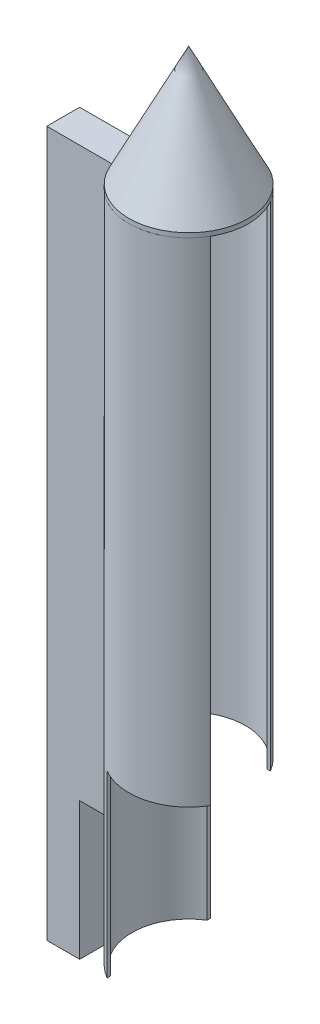
ISO-10303-21;
HEADER;
FILE_DESCRIPTION(('STEP AP214'),'2;1');
FILE_NAME('part.step','',(''),(''),'','','');
FILE_SCHEMA(('AUTOMOTIVE_DESIGN { 1 0 10303 214 1 1 1 1 }'));
ENDSEC;
DATA;
#1=APPLICATION_CONTEXT('core data for automotive mechanical design processes');
#2=APPLICATION_PROTOCOL_DEFINITION('international standard','automotive_design',2000,#1);
#3=PRODUCT_CONTEXT('',#1,'mechanical');
#4=PRODUCT('Part','Part','',(#3));
#5=PRODUCT_RELATED_PRODUCT_CATEGORY('part','',(#4));
#6=PRODUCT_DEFINITION_FORMATION('','',#4);
#7=PRODUCT_DEFINITION_CONTEXT('part definition',#1,'design');
#8=PRODUCT_DEFINITION('design','',#6,#7);
#9=PRODUCT_DEFINITION_SHAPE('','',#8);
#10=(LENGTH_UNIT() NAMED_UNIT(*) SI_UNIT(.MILLI.,.METRE.));
#11=(NAMED_UNIT(*) PLANE_ANGLE_UNIT() SI_UNIT($,.RADIAN.));
#12=(NAMED_UNIT(*) SI_UNIT($,.STERADIAN.) SOLID_ANGLE_UNIT());
#13=UNCERTAINTY_MEASURE_WITH_UNIT(LENGTH_MEASURE(1.E-05),#10,'distance_accuracy_value','');
#14=(GEOMETRIC_REPRESENTATION_CONTEXT(3) GLOBAL_UNCERTAINTY_ASSIGNED_CONTEXT((#13)) GLOBAL_UNIT_ASSIGNED_CONTEXT((#10,
#11,#12)) REPRESENTATION_CONTEXT('',''));
#15=CARTESIAN_POINT('',(0.,0.,0.));
#16=DIRECTION('',(0.,0.,1.));
#17=DIRECTION('',(1.,0.,0.));
#18=AXIS2_PLACEMENT_3D('',#15,#16,#17);
#19=CARTESIAN_POINT('',(-11.01,0.,11.01));
#20=DIRECTION('',(0.,-1.,0.));
#21=DIRECTION('',(0.,0.,-1.));
#22=AXIS2_PLACEMENT_3D('',#19,#20,#21);
#23=PLANE('',#22);
#24=DIRECTION('',(-1.,0.,0.));
#25=VECTOR('',#24,1.);
#26=CARTESIAN_POINT('',(-11.,0.,-11.));
#27=LINE('',#26,#25);
#28=CARTESIAN_POINT('',(11.,0.,-11.));
#29=VERTEX_POINT('',#28);
#30=CARTESIAN_POINT('',(-11.,0.,-11.));
#31=VERTEX_POINT('',#30);
#32=EDGE_CURVE('P0_E73',#29,#31,#27,.T.);
#33=ORIENTED_EDGE('',*,*,#32,.F.);
#34=DIRECTION('',(0.,0.,-1.));
#35=VECTOR('',#34,1.);
#36=CARTESIAN_POINT('',(11.,0.,0.));
#37=LINE('',#36,#35);
#38=CARTESIAN_POINT('',(11.,0.,11.));
#39=VERTEX_POINT('',#38);
#40=EDGE_CURVE('P0_E21',#39,#29,#37,.T.);
#41=ORIENTED_EDGE('',*,*,#40,.F.);
#42=DIRECTION('',(1.,0.,0.));
#43=VECTOR('',#42,1.);
#44=CARTESIAN_POINT('',(-11.,0.,11.));
#45=LINE('',#44,#43);
#46=CARTESIAN_POINT('',(-11.,0.,11.));
#47=VERTEX_POINT('',#46);
#48=EDGE_CURVE('P0_E68',#47,#39,#45,.T.);
#49=ORIENTED_EDGE('',*,*,#48,.F.);
#50=DIRECTION('',(0.,0.,1.));
#51=VECTOR('',#50,1.);
#52=CARTESIAN_POINT('',(-11.,0.,0.));
#53=LINE('',#52,#51);
#54=EDGE_CURVE('P0_E90',#31,#47,#53,.T.);
#55=ORIENTED_EDGE('',*,*,#54,.F.);
#56=EDGE_LOOP('',(#33,#41,#49,#55));
#57=FACE_BOUND('',#56,.T.);
#58=ADVANCED_FACE('P0_F17',(#57),#23,.T.);
#59=CARTESIAN_POINT('',(-33.01,380.,-11.01));
#60=DIRECTION('',(0.,1.,0.));
#61=DIRECTION('',(0.,0.,1.));
#62=AXIS2_PLACEMENT_3D('',#59,#60,#61);
#63=PLANE('',#62);
#64=DIRECTION('',(1.,0.,0.));
#65=VECTOR('',#64,1.);
#66=CARTESIAN_POINT('',(-11.,380.,-11.));
#67=LINE('',#66,#65);
#68=CARTESIAN_POINT('',(-33.,380.,-11.));
#69=VERTEX_POINT('',#68);
#70=CARTESIAN_POINT('',(11.,380.,-11.));
#71=VERTEX_POINT('',#70);
#72=EDGE_CURVE('P0_E106',#69,#71,#67,.T.);
#73=ORIENTED_EDGE('',*,*,#72,.F.);
#74=DIRECTION('',(0.,0.,-1.));
#75=VECTOR('',#74,1.);
#76=CARTESIAN_POINT('',(-33.,380.,0.));
#77=LINE('',#76,#75);
#78=CARTESIAN_POINT('',(-33.,380.,11.));
#79=VERTEX_POINT('',#78);
#80=EDGE_CURVE('P0_E96',#79,#69,#77,.T.);
#81=ORIENTED_EDGE('',*,*,#80,.F.);
#82=DIRECTION('',(-1.,0.,0.));
#83=VECTOR('',#82,1.);
#84=CARTESIAN_POINT('',(-11.,380.,11.));
#85=LINE('',#84,#83);
#86=CARTESIAN_POINT('',(11.,380.,11.));
#87=VERTEX_POINT('',#86);
#88=EDGE_CURVE('P0_E84',#87,#79,#85,.T.);
#89=ORIENTED_EDGE('',*,*,#88,.F.);
#90=DIRECTION('',(0.,0.,1.));
#91=VECTOR('',#90,1.);
#92=CARTESIAN_POINT('',(11.,380.,0.));
#93=LINE('',#92,#91);
#94=EDGE_CURVE('P0_E77',#71,#87,#93,.T.);
#95=ORIENTED_EDGE('',*,*,#94,.F.);
#96=EDGE_LOOP('',(#73,#81,#89,#95));
#97=FACE_BOUND('',#96,.T.);
#98=ADVANCED_FACE('P0_F122',(#97),#63,.T.);
#99=CARTESIAN_POINT('',(11.,-0.01,11.01));
#100=DIRECTION('',(1.,0.,0.));
#101=DIRECTION('',(0.,0.,-1.));
#102=AXIS2_PLACEMENT_3D('',#99,#100,#101);
#103=PLANE('',#102);
#104=ORIENTED_EDGE('',*,*,#94,.T.);
#105=DIRECTION('',(0.,1.,0.));
#106=VECTOR('',#105,1.);
#107=CARTESIAN_POINT('',(11.,144.,11.));
#108=LINE('',#107,#106);
#109=EDGE_CURVE('P0_E79',#39,#87,#108,.T.);
#110=ORIENTED_EDGE('',*,*,#109,.F.);
#111=ORIENTED_EDGE('',*,*,#40,.T.);
#112=DIRECTION('',(0.,-1.,0.));
#113=VECTOR('',#112,1.);
#114=CARTESIAN_POINT('',(11.,144.,-11.));
#115=LINE('',#114,#113);
#116=EDGE_CURVE('P0_E109',#71,#29,#115,.T.);
#117=ORIENTED_EDGE('',*,*,#116,.F.);
#118=EDGE_LOOP('',(#104,#110,#111,#117));
#119=FACE_BOUND('',#118,.T.);
#120=ADVANCED_FACE('P0_F80',(#119),#103,.T.);
#121=CARTESIAN_POINT('',(-11.,-92.0100000000001,11.01));
#122=DIRECTION('',(1.,0.,0.));
#123=DIRECTION('',(0.,0.,-1.));
#124=AXIS2_PLACEMENT_3D('',#121,#122,#123);
#125=PLANE('',#124);
#126=DIRECTION('',(0.,0.,1.));
#127=VECTOR('',#126,1.);
#128=CARTESIAN_POINT('',(-11.,-92.,0.));
#129=LINE('',#128,#127);
#130=CARTESIAN_POINT('',(-11.,-92.,-10.9999999999999));
#131=VERTEX_POINT('',#130);
#132=CARTESIAN_POINT('',(-11.,-92.,11.));
#133=VERTEX_POINT('',#132);
#134=EDGE_CURVE('P0_E111',#131,#133,#129,.T.);
#135=ORIENTED_EDGE('',*,*,#134,.F.);
#136=DIRECTION('',(0.,-1.,0.));
#137=VECTOR('',#136,1.);
#138=CARTESIAN_POINT('',(-11.,144.,-11.));
#139=LINE('',#138,#137);
#140=EDGE_CURVE('P0_E102',#31,#131,#139,.T.);
#141=ORIENTED_EDGE('',*,*,#140,.F.);
#142=ORIENTED_EDGE('',*,*,#54,.T.);
#143=DIRECTION('',(0.,1.,0.));
#144=VECTOR('',#143,1.);
#145=CARTESIAN_POINT('',(-11.,144.,11.));
#146=LINE('',#145,#144);
#147=EDGE_CURVE('P0_E89',#133,#47,#146,.T.);
#148=ORIENTED_EDGE('',*,*,#147,.F.);
#149=EDGE_LOOP('',(#135,#141,#142,#148));
#150=FACE_BOUND('',#149,.T.);
#151=ADVANCED_FACE('P0_F127',(#150),#125,.T.);
#152=CARTESIAN_POINT('',(-33.01,-92.01,11.));
#153=DIRECTION('',(0.,0.,1.));
#154=DIRECTION('',(1.,0.,0.));
#155=AXIS2_PLACEMENT_3D('',#152,#153,#154);
#156=PLANE('',#155);
#157=DIRECTION('',(-1.,0.,0.));
#158=VECTOR('',#157,1.);
#159=CARTESIAN_POINT('',(-22.,-92.,11.));
#160=LINE('',#159,#158);
#161=CARTESIAN_POINT('',(-33.,-92.,11.));
#162=VERTEX_POINT('',#161);
#163=EDGE_CURVE('P0_E114',#133,#162,#160,.T.);
#164=ORIENTED_EDGE('',*,*,#163,.F.);
#165=ORIENTED_EDGE('',*,*,#147,.T.);
#166=ORIENTED_EDGE('',*,*,#48,.T.);
#167=ORIENTED_EDGE('',*,*,#109,.T.);
#168=ORIENTED_EDGE('',*,*,#88,.T.);
#169=DIRECTION('',(0.,1.,0.));
#170=VECTOR('',#169,1.);
#171=CARTESIAN_POINT('',(-33.,144.,11.));
#172=LINE('',#171,#170);
#173=EDGE_CURVE('P0_E98',#162,#79,#172,.T.);
#174=ORIENTED_EDGE('',*,*,#173,.F.);
#175=EDGE_LOOP('',(#164,#165,#166,#167,#168,#174));
#176=FACE_BOUND('',#175,.T.);
#177=ADVANCED_FACE('P0_F88',(#176),#156,.T.);
#178=CARTESIAN_POINT('',(-33.,-92.01,-11.01));
#179=DIRECTION('',(-1.,0.,0.));
#180=DIRECTION('',(0.,0.,1.));
#181=AXIS2_PLACEMENT_3D('',#178,#179,#180);
#182=PLANE('',#181);
#183=DIRECTION('',(0.,0.,-1.));
#184=VECTOR('',#183,1.);
#185=CARTESIAN_POINT('',(-33.,-92.,0.));
#186=LINE('',#185,#184);
#187=CARTESIAN_POINT('',(-33.,-92.,-11.));
#188=VERTEX_POINT('',#187);
#189=EDGE_CURVE('P0_E27',#162,#188,#186,.T.);
#190=ORIENTED_EDGE('',*,*,#189,.F.);
#191=ORIENTED_EDGE('',*,*,#173,.T.);
#192=ORIENTED_EDGE('',*,*,#80,.T.);
#193=DIRECTION('',(0.,1.,0.));
#194=VECTOR('',#193,1.);
#195=CARTESIAN_POINT('',(-33.,144.,-11.));
#196=LINE('',#195,#194);
#197=EDGE_CURVE('P0_E36',#188,#69,#196,.T.);
#198=ORIENTED_EDGE('',*,*,#197,.F.);
#199=EDGE_LOOP('',(#190,#191,#192,#198));
#200=FACE_BOUND('',#199,.T.);
#201=ADVANCED_FACE('P0_F119',(#200),#182,.T.);
#202=CARTESIAN_POINT('',(11.01,-92.01,-11.));
#203=DIRECTION('',(0.,0.,-1.));
#204=DIRECTION('',(-1.,0.,0.));
#205=AXIS2_PLACEMENT_3D('',#202,#203,#204);
#206=PLANE('',#205);
#207=ORIENTED_EDGE('',*,*,#72,.T.);
#208=ORIENTED_EDGE('',*,*,#116,.T.);
#209=ORIENTED_EDGE('',*,*,#32,.T.);
#210=ORIENTED_EDGE('',*,*,#140,.T.);
#211=DIRECTION('',(1.,0.,0.));
#212=VECTOR('',#211,1.);
#213=CARTESIAN_POINT('',(-22.,-92.,-10.9999999999999));
#214=LINE('',#213,#212);
#215=EDGE_CURVE('P0_E11',#188,#131,#214,.T.);
#216=ORIENTED_EDGE('',*,*,#215,.F.);
#217=ORIENTED_EDGE('',*,*,#197,.T.);
#218=EDGE_LOOP('',(#207,#208,#209,#210,#216,#217));
#219=FACE_BOUND('',#218,.T.);
#220=ADVANCED_FACE('P0_F124',(#219),#206,.T.);
#221=CARTESIAN_POINT('',(-10.99,-92.,-11.0099999999999));
#222=DIRECTION('',(0.,-1.,0.));
#223=DIRECTION('',(0.,0.,1.));
#224=AXIS2_PLACEMENT_3D('',#221,#222,#223);
#225=PLANE('',#224);
#226=ORIENTED_EDGE('',*,*,#189,.T.);
#227=ORIENTED_EDGE('',*,*,#215,.T.);
#228=ORIENTED_EDGE('',*,*,#134,.T.);
#229=ORIENTED_EDGE('',*,*,#163,.T.);
#230=EDGE_LOOP('',(#226,#227,#228,#229));
#231=FACE_BOUND('',#230,.T.);
#232=ADVANCED_FACE('P0_F19',(#231),#225,.T.);
#233=CLOSED_SHELL('',(#58,#98,#120,#151,#177,#201,#220,#232));
#234=MANIFOLD_SOLID_BREP('P0_B1',#233);
#235=CARTESIAN_POINT('',(30.99,50.,-54.6510161513775));
#236=DIRECTION('',(0.,-1.,0.));
#237=DIRECTION('',(1.,0.,0.));
#238=AXIS2_PLACEMENT_3D('',#235,#236,#237);
#239=PLANE('',#238);
#240=CARTESIAN_POINT('',(51.,50.,0.));
#241=DIRECTION('',(0.,1.,0.));
#242=DIRECTION('',(0.,0.,1.));
#243=AXIS2_PLACEMENT_3D('',#240,#241,#242);
#244=CIRCLE('',#243,40.);
#245=CARTESIAN_POINT('',(85.6410161513775,50.,-20.0000000000001));
#246=VERTEX_POINT('',#245);
#247=CARTESIAN_POINT('',(31.,50.,-34.6410161513776));
#248=VERTEX_POINT('',#247);
#249=EDGE_CURVE('P1_E86',#246,#248,#244,.T.);
#250=ORIENTED_EDGE('',*,*,#249,.F.);
#251=DIRECTION('',(1.,0.,0.));
#252=VECTOR('',#251,1.);
#253=CARTESIAN_POINT('',(84.4760024970923,50.,-20.0000000000001));
#254=LINE('',#253,#252);
#255=CARTESIAN_POINT('',(83.3109888428069,50.,-20.0000000000001));
#256=VERTEX_POINT('',#255);
#257=EDGE_CURVE('P1_E83',#256,#246,#254,.T.);
#258=ORIENTED_EDGE('',*,*,#257,.F.);
#259=CARTESIAN_POINT('',(51.,50.,0.));
#260=DIRECTION('',(0.,-1.,0.));
#261=DIRECTION('',(0.,0.,-1.));
#262=AXIS2_PLACEMENT_3D('',#259,#260,#261);
#263=CIRCLE('',#262,38.);
#264=CARTESIAN_POINT('',(31.,50.,-32.3109888428069));
#265=VERTEX_POINT('',#264);
#266=EDGE_CURVE('P1_E21',#265,#256,#263,.T.);
#267=ORIENTED_EDGE('',*,*,#266,.F.);
#268=DIRECTION('',(0.,0.,1.));
#269=VECTOR('',#268,1.);
#270=CARTESIAN_POINT('',(31.,50.,-33.4760024970923));
#271=LINE('',#270,#269);
#272=EDGE_CURVE('P1_E105',#248,#265,#271,.T.);
#273=ORIENTED_EDGE('',*,*,#272,.F.);
#274=EDGE_LOOP('',(#250,#258,#267,#273));
#275=FACE_BOUND('',#274,.T.);
#276=ADVANCED_FACE('P1_F17',(#275),#239,.T.);
#277=CARTESIAN_POINT('',(83.3009888428071,380.01,19.9999999999999));
#278=DIRECTION('',(0.,0.,-1.));
#279=DIRECTION('',(1.,0.,0.));
#280=AXIS2_PLACEMENT_3D('',#277,#278,#279);
#281=PLANE('',#280);
#282=DIRECTION('',(-1.,0.,0.));
#283=VECTOR('',#282,1.);
#284=CARTESIAN_POINT('',(48.3205080756887,380.,19.9999999999999));
#285=LINE('',#284,#283);
#286=CARTESIAN_POINT('',(85.6410161513776,380.,19.9999999999999));
#287=VERTEX_POINT('',#286);
#288=CARTESIAN_POINT('',(83.3109888428071,380.,19.9999999999999));
#289=VERTEX_POINT('',#288);
#290=EDGE_CURVE('P1_E91',#287,#289,#285,.T.);
#291=ORIENTED_EDGE('',*,*,#290,.F.);
#292=DIRECTION('',(0.,1.,0.));
#293=VECTOR('',#292,1.);
#294=CARTESIAN_POINT('',(85.6410161513776,155.,19.9999999999999));
#295=LINE('',#294,#293);
#296=CARTESIAN_POINT('',(85.6410161513776,50.,19.9999999999999));
#297=VERTEX_POINT('',#296);
#298=EDGE_CURVE('P1_E124',#297,#287,#295,.T.);
#299=ORIENTED_EDGE('',*,*,#298,.F.);
#300=DIRECTION('',(1.,0.,0.));
#301=VECTOR('',#300,1.);
#302=CARTESIAN_POINT('',(58.3205080756888,50.,19.9999999999999));
#303=LINE('',#302,#301);
#304=CARTESIAN_POINT('',(83.3109888428071,50.,19.9999999999999));
#305=VERTEX_POINT('',#304);
#306=EDGE_CURVE('P1_E130',#305,#297,#303,.T.);
#307=ORIENTED_EDGE('',*,*,#306,.F.);
#308=DIRECTION('',(0.,-1.,0.));
#309=VECTOR('',#308,1.);
#310=CARTESIAN_POINT('',(83.3109888428071,155.,19.9999999999999));
#311=LINE('',#310,#309);
#312=EDGE_CURVE('P1_E112',#289,#305,#311,.T.);
#313=ORIENTED_EDGE('',*,*,#312,.F.);
#314=EDGE_LOOP('',(#291,#299,#307,#313));
#315=FACE_BOUND('',#314,.T.);
#316=ADVANCED_FACE('P1_F142',(#315),#281,.T.);
#317=CARTESIAN_POINT('',(10.9899999999999,380.,-46.5909865839671));
#318=DIRECTION('',(0.,1.,0.));
#319=DIRECTION('',(0.,0.,1.));
#320=AXIS2_PLACEMENT_3D('',#317,#318,#319);
#321=PLANE('',#320);
#322=CARTESIAN_POINT('',(51.,380.,0.));
#323=DIRECTION('',(0.,-1.,0.));
#324=DIRECTION('',(0.,0.,-1.));
#325=AXIS2_PLACEMENT_3D('',#322,#323,#324);
#326=CIRCLE('',#325,38.);
#327=CARTESIAN_POINT('',(83.3109888428069,380.,-20.0000000000001));
#328=VERTEX_POINT('',#327);
#329=EDGE_CURVE('P1_E99',#328,#289,#326,.F.);
#330=ORIENTED_EDGE('',*,*,#329,.F.);
#331=DIRECTION('',(-1.,0.,0.));
#332=VECTOR('',#331,1.);
#333=CARTESIAN_POINT('',(84.4760024970923,380.,-20.0000000000001));
#334=LINE('',#333,#332);
#335=CARTESIAN_POINT('',(85.6410161513775,380.,-20.0000000000001));
#336=VERTEX_POINT('',#335);
#337=EDGE_CURVE('P1_E90',#336,#328,#334,.T.);
#338=ORIENTED_EDGE('',*,*,#337,.F.);
#339=CARTESIAN_POINT('',(51.,380.,0.));
#340=DIRECTION('',(0.,1.,0.));
#341=DIRECTION('',(0.,0.,1.));
#342=AXIS2_PLACEMENT_3D('',#339,#340,#341);
#343=CIRCLE('',#342,40.);
#344=EDGE_CURVE('P1_E120',#287,#336,#343,.F.);
#345=ORIENTED_EDGE('',*,*,#344,.F.);
#346=ORIENTED_EDGE('',*,*,#290,.T.);
#347=EDGE_LOOP('',(#330,#338,#345,#346));
#348=FACE_BOUND('',#347,.T.);
#349=ADVANCED_FACE('P1_F136',(#348),#321,.T.);
#350=CARTESIAN_POINT('',(85.6510161513776,380.01,-20.0000000000001));
#351=DIRECTION('',(0.,0.,1.));
#352=DIRECTION('',(-1.,0.,0.));
#353=AXIS2_PLACEMENT_3D('',#350,#351,#352);
#354=PLANE('',#353);
#355=ORIENTED_EDGE('',*,*,#337,.T.);
#356=DIRECTION('',(0.,1.,0.));
#357=VECTOR('',#356,1.);
#358=CARTESIAN_POINT('',(83.3109888428069,155.,-20.0000000000001));
#359=LINE('',#358,#357);
#360=EDGE_CURVE('P1_E94',#256,#328,#359,.T.);
#361=ORIENTED_EDGE('',*,*,#360,.F.);
#362=ORIENTED_EDGE('',*,*,#257,.T.);
#363=DIRECTION('',(0.,-1.,0.));
#364=VECTOR('',#363,1.);
#365=CARTESIAN_POINT('',(85.6410161513775,155.,-20.0000000000001));
#366=LINE('',#365,#364);
#367=EDGE_CURVE('P1_E123',#336,#246,#366,.T.);
#368=ORIENTED_EDGE('',*,*,#367,.F.);
#369=EDGE_LOOP('',(#355,#361,#362,#368));
#370=FACE_BOUND('',#369,.T.);
#371=ADVANCED_FACE('P1_F95',(#370),#354,.T.);
#372=CARTESIAN_POINT('',(31.,-70.01,-34.6510161513776));
#373=DIRECTION('',(1.,0.,0.));
#374=DIRECTION('',(0.,1.,0.));
#375=AXIS2_PLACEMENT_3D('',#372,#373,#374);
#376=PLANE('',#375);
#377=DIRECTION('',(0.,-1.,0.));
#378=VECTOR('',#377,1.);
#379=CARTESIAN_POINT('',(31.,155.,-34.6410161513775));
#380=LINE('',#379,#378);
#381=CARTESIAN_POINT('',(31.,-69.9999999999999,-34.6410161513776));
#382=VERTEX_POINT('',#381);
#383=EDGE_CURVE('P1_E128',#248,#382,#380,.T.);
#384=ORIENTED_EDGE('',*,*,#383,.F.);
#385=ORIENTED_EDGE('',*,*,#272,.T.);
#386=DIRECTION('',(0.,1.,0.));
#387=VECTOR('',#386,1.);
#388=CARTESIAN_POINT('',(31.,155.,-32.310988842807));
#389=LINE('',#388,#387);
#390=CARTESIAN_POINT('',(31.,-69.9999999999999,-32.3109888428069));
#391=VERTEX_POINT('',#390);
#392=EDGE_CURVE('P1_E104',#391,#265,#389,.T.);
#393=ORIENTED_EDGE('',*,*,#392,.F.);
#394=DIRECTION('',(0.,0.,1.));
#395=VECTOR('',#394,1.);
#396=CARTESIAN_POINT('',(31.,-69.9999999999999,0.));
#397=LINE('',#396,#395);
#398=EDGE_CURVE('P1_E119',#382,#391,#397,.T.);
#399=ORIENTED_EDGE('',*,*,#398,.F.);
#400=EDGE_LOOP('',(#384,#385,#393,#399));
#401=FACE_BOUND('',#400,.T.);
#402=ADVANCED_FACE('P1_F163',(#401),#376,.T.);
#403=CARTESIAN_POINT('',(51.,380.,0.));
#404=DIRECTION('',(0.,-1.,0.));
#405=DIRECTION('',(0.,0.,-1.));
#406=AXIS2_PLACEMENT_3D('',#403,#404,#405);
#407=CYLINDRICAL_SURFACE('',#406,38.);
#408=CARTESIAN_POINT('',(51.,-69.9999999999999,0.));
#409=DIRECTION('',(0.,-1.,0.));
#410=DIRECTION('',(0.,0.,-1.));
#411=AXIS2_PLACEMENT_3D('',#408,#409,#410);
#412=CIRCLE('',#411,38.);
#413=CARTESIAN_POINT('',(31.,-69.9999999999999,32.310988842807));
#414=VERTEX_POINT('',#413);
#415=EDGE_CURVE('P1_E116',#391,#414,#412,.F.);
#416=ORIENTED_EDGE('',*,*,#415,.F.);
#417=ORIENTED_EDGE('',*,*,#392,.T.);
#418=ORIENTED_EDGE('',*,*,#266,.T.);
#419=ORIENTED_EDGE('',*,*,#360,.T.);
#420=ORIENTED_EDGE('',*,*,#329,.T.);
#421=ORIENTED_EDGE('',*,*,#312,.T.);
#422=CARTESIAN_POINT('',(51.,50.,0.));
#423=DIRECTION('',(0.,-1.,0.));
#424=DIRECTION('',(0.,0.,-1.));
#425=AXIS2_PLACEMENT_3D('',#422,#423,#424);
#426=CIRCLE('',#425,38.);
#427=CARTESIAN_POINT('',(31.,50.,32.310988842807));
#428=VERTEX_POINT('',#427);
#429=EDGE_CURVE('P1_E131',#428,#305,#426,.F.);
#430=ORIENTED_EDGE('',*,*,#429,.F.);
#431=DIRECTION('',(0.,1.,0.));
#432=VECTOR('',#431,1.);
#433=CARTESIAN_POINT('',(31.,-10.,32.310988842807));
#434=LINE('',#433,#432);
#435=EDGE_CURVE('P1_E115',#414,#428,#434,.T.);
#436=ORIENTED_EDGE('',*,*,#435,.F.);
#437=EDGE_LOOP('',(#416,#417,#418,#419,#420,#421,#430,#436));
#438=FACE_BOUND('',#437,.T.);
#439=ADVANCED_FACE('P1_F103',(#438),#407,.F.);
#440=CARTESIAN_POINT('',(30.99,50.,19.9899999999999));
#441=DIRECTION('',(0.,-1.,0.));
#442=DIRECTION('',(1.,0.,0.));
#443=AXIS2_PLACEMENT_3D('',#440,#441,#442);
#444=PLANE('',#443);
#445=CARTESIAN_POINT('',(51.,50.,0.));
#446=DIRECTION('',(0.,1.,0.));
#447=DIRECTION('',(0.,0.,1.));
#448=AXIS2_PLACEMENT_3D('',#445,#446,#447);
#449=CIRCLE('',#448,40.);
#450=CARTESIAN_POINT('',(31.,50.,34.6410161513775));
#451=VERTEX_POINT('',#450);
#452=EDGE_CURVE('P1_E125',#451,#297,#449,.T.);
#453=ORIENTED_EDGE('',*,*,#452,.F.);
#454=DIRECTION('',(0.,0.,1.));
#455=VECTOR('',#454,1.);
#456=CARTESIAN_POINT('',(31.,50.,33.4760024970923));
#457=LINE('',#456,#455);
#458=EDGE_CURVE('P1_E148',#428,#451,#457,.T.);
#459=ORIENTED_EDGE('',*,*,#458,.F.);
#460=ORIENTED_EDGE('',*,*,#429,.T.);
#461=ORIENTED_EDGE('',*,*,#306,.T.);
#462=EDGE_LOOP('',(#453,#459,#460,#461));
#463=FACE_BOUND('',#462,.T.);
#464=ADVANCED_FACE('P1_F146',(#463),#444,.T.);
#465=CARTESIAN_POINT('',(51.,-70.,0.));
#466=DIRECTION('',(0.,1.,0.));
#467=DIRECTION('',(0.,0.,1.));
#468=AXIS2_PLACEMENT_3D('',#465,#466,#467);
#469=CYLINDRICAL_SURFACE('',#468,40.);
#470=ORIENTED_EDGE('',*,*,#344,.T.);
#471=ORIENTED_EDGE('',*,*,#367,.T.);
#472=ORIENTED_EDGE('',*,*,#249,.T.);
#473=ORIENTED_EDGE('',*,*,#383,.T.);
#474=CARTESIAN_POINT('',(51.,-69.9999999999999,0.));
#475=DIRECTION('',(0.,1.,0.));
#476=DIRECTION('',(0.,0.,1.));
#477=AXIS2_PLACEMENT_3D('',#474,#475,#476);
#478=CIRCLE('',#477,40.);
#479=CARTESIAN_POINT('',(31.,-69.9999999999999,34.6410161513775));
#480=VERTEX_POINT('',#479);
#481=EDGE_CURVE('P1_E36',#480,#382,#478,.F.);
#482=ORIENTED_EDGE('',*,*,#481,.F.);
#483=DIRECTION('',(0.,-1.,0.));
#484=VECTOR('',#483,1.);
#485=CARTESIAN_POINT('',(31.,-10.,34.6410161513774));
#486=LINE('',#485,#484);
#487=EDGE_CURVE('P1_E27',#451,#480,#486,.T.);
#488=ORIENTED_EDGE('',*,*,#487,.F.);
#489=ORIENTED_EDGE('',*,*,#452,.T.);
#490=ORIENTED_EDGE('',*,*,#298,.T.);
#491=EDGE_LOOP('',(#470,#471,#472,#473,#482,#488,#489,#490));
#492=FACE_BOUND('',#491,.T.);
#493=ADVANCED_FACE('P1_F162',(#492),#469,.T.);
#494=CARTESIAN_POINT('',(10.99,-69.9999999999999,34.6510161513776));
#495=DIRECTION('',(0.,-1.,0.));
#496=DIRECTION('',(0.,0.,-1.));
#497=AXIS2_PLACEMENT_3D('',#494,#495,#496);
#498=PLANE('',#497);
#499=DIRECTION('',(0.,0.,-1.));
#500=VECTOR('',#499,1.);
#501=CARTESIAN_POINT('',(31.,-69.9999999999999,33.4760024970922));
#502=LINE('',#501,#500);
#503=EDGE_CURVE('P1_E11',#480,#414,#502,.T.);
#504=ORIENTED_EDGE('',*,*,#503,.F.);
#505=ORIENTED_EDGE('',*,*,#481,.T.);
#506=ORIENTED_EDGE('',*,*,#398,.T.);
#507=ORIENTED_EDGE('',*,*,#415,.T.);
#508=EDGE_LOOP('',(#504,#505,#506,#507));
#509=FACE_BOUND('',#508,.T.);
#510=ADVANCED_FACE('P1_F154',(#509),#498,.T.);
#511=CARTESIAN_POINT('',(31.,-70.01,32.300988842807));
#512=DIRECTION('',(1.,0.,0.));
#513=DIRECTION('',(0.,1.,0.));
#514=AXIS2_PLACEMENT_3D('',#511,#512,#513);
#515=PLANE('',#514);
#516=ORIENTED_EDGE('',*,*,#487,.T.);
#517=ORIENTED_EDGE('',*,*,#503,.T.);
#518=ORIENTED_EDGE('',*,*,#435,.T.);
#519=ORIENTED_EDGE('',*,*,#458,.T.);
#520=EDGE_LOOP('',(#516,#517,#518,#519));
#521=FACE_BOUND('',#520,.T.);
#522=ADVANCED_FACE('P1_F19',(#521),#515,.T.);
#523=CLOSED_SHELL('',(#276,#316,#349,#371,#402,#439,#464,#493,#510,#522));
#524=MANIFOLD_SOLID_BREP('P1_B1',#523);
#525=CARTESIAN_POINT('',(10.99,383.,-40.01));
#526=DIRECTION('',(0.,1.,0.));
#527=DIRECTION('',(0.,0.,1.));
#528=AXIS2_PLACEMENT_3D('',#525,#526,#527);
#529=PLANE('',#528);
#530=CARTESIAN_POINT('',(51.,383.,0.));
#531=DIRECTION('',(0.,-1.,0.));
#532=DIRECTION('',(1.,0.,0.));
#533=AXIS2_PLACEMENT_3D('',#530,#531,#532);
#534=CIRCLE('',#533,40.);
#535=CARTESIAN_POINT('',(91.,383.,0.));
#536=VERTEX_POINT('',#535);
#537=EDGE_CURVE('P2_E19',#536,#536,#534,.T.);
#538=ORIENTED_EDGE('',*,*,#537,.F.);
#539=EDGE_LOOP('',(#538));
#540=FACE_BOUND('',#539,.T.);
#541=ADVANCED_FACE('P2_F15',(#540),#529,.T.);
#542=CARTESIAN_POINT('',(10.99,380.,40.01));
#543=DIRECTION('',(0.,-1.,0.));
#544=DIRECTION('',(0.,0.,-1.));
#545=AXIS2_PLACEMENT_3D('',#542,#543,#544);
#546=PLANE('',#545);
#547=CARTESIAN_POINT('',(51.,380.,0.));
#548=DIRECTION('',(0.,-1.,0.));
#549=DIRECTION('',(1.,0.,0.));
#550=AXIS2_PLACEMENT_3D('',#547,#548,#549);
#551=CIRCLE('',#550,40.);
#552=CARTESIAN_POINT('',(91.,380.,0.));
#553=VERTEX_POINT('',#552);
#554=EDGE_CURVE('P2_E10',#553,#553,#551,.F.);
#555=ORIENTED_EDGE('',*,*,#554,.F.);
#556=EDGE_LOOP('',(#555));
#557=FACE_BOUND('',#556,.T.);
#558=ADVANCED_FACE('P2_F30',(#557),#546,.T.);
#559=CARTESIAN_POINT('',(51.,383.,0.));
#560=DIRECTION('',(0.,-1.,0.));
#561=DIRECTION('',(1.,0.,0.));
#562=AXIS2_PLACEMENT_3D('',#559,#560,#561);
#563=CYLINDRICAL_SURFACE('',#562,40.);
#564=ORIENTED_EDGE('',*,*,#554,.T.);
#565=EDGE_LOOP('',(#564));
#566=FACE_BOUND('',#565,.T.);
#567=ORIENTED_EDGE('',*,*,#537,.T.);
#568=EDGE_LOOP('',(#567));
#569=FACE_BOUND('',#568,.T.);
#570=ADVANCED_FACE('P2_F17',(#566,#569),#563,.T.);
#571=CLOSED_SHELL('',(#541,#558,#570));
#572=MANIFOLD_SOLID_BREP('P2_B1',#571);
#573=CARTESIAN_POINT('',(51.,463.,0.));
#574=DIRECTION('',(0.,-1.,0.));
#575=DIRECTION('',(1.,0.,0.));
#576=AXIS2_PLACEMENT_3D('',#573,#574,#575);
#577=CONICAL_SURFACE('',#576,0.,0.463647609000805);
#578=CARTESIAN_POINT('',(51.0000000000001,383.,-1.11022302462516E-13));
#579=DIRECTION('',(0.,-1.,0.));
#580=DIRECTION('',(1.,0.,0.));
#581=AXIS2_PLACEMENT_3D('',#578,#579,#580);
#582=CIRCLE('',#581,39.9999999999999);
#583=CARTESIAN_POINT('',(91.,383.,-1.11022302462516E-13));
#584=VERTEX_POINT('',#583);
#585=EDGE_CURVE('P3_E11',#584,#584,#582,.T.);
#586=ORIENTED_EDGE('',*,*,#585,.F.);
#587=EDGE_LOOP('',(#586));
#588=FACE_BOUND('',#587,.T.);
#589=CARTESIAN_POINT('',(51.,463.,0.));
#590=VERTEX_POINT('',#589);
#591=VERTEX_LOOP('',#590);
#592=FACE_BOUND('',#591,.T.);
#593=ADVANCED_FACE('P3_F17',(#588,#592),#577,.T.);
#594=CARTESIAN_POINT('',(10.99,383.,40.01));
#595=DIRECTION('',(0.,-1.,0.));
#596=DIRECTION('',(0.,0.,-1.));
#597=AXIS2_PLACEMENT_3D('',#594,#595,#596);
#598=PLANE('',#597);
#599=ORIENTED_EDGE('',*,*,#585,.T.);
#600=EDGE_LOOP('',(#599));
#601=FACE_BOUND('',#600,.T.);
#602=ADVANCED_FACE('P3_F19',(#601),#598,.T.);
#603=CLOSED_SHELL('',(#593,#602));
#604=MANIFOLD_SOLID_BREP('P3_B1',#603);
#605=ADVANCED_BREP_SHAPE_REPRESENTATION('',(#18,#234,#524,#572,#604),#14);
#606=SHAPE_DEFINITION_REPRESENTATION(#9,#605);
ENDSEC;
END-ISO-10303-21;
